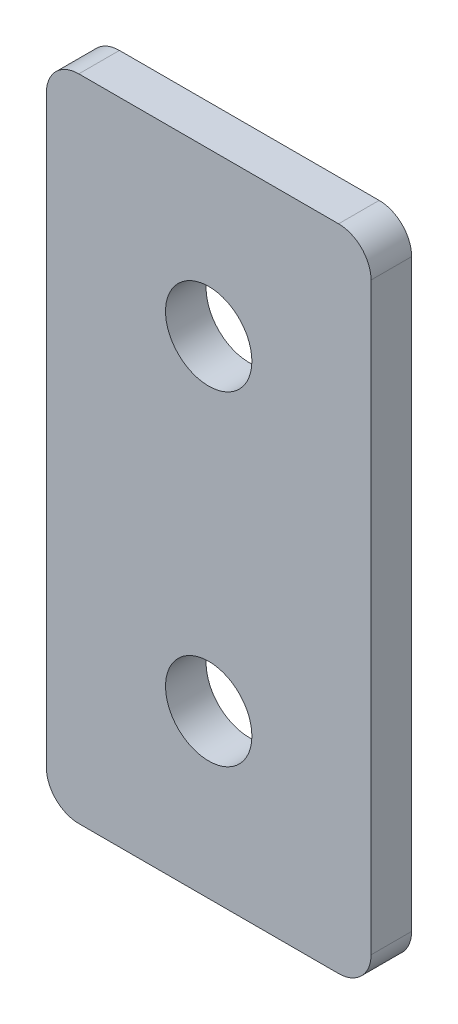
ISO-10303-21;
HEADER;
FILE_DESCRIPTION(('STEP AP214'),'2;1');
FILE_NAME('part.step','',(''),(''),'','','');
FILE_SCHEMA(('AUTOMOTIVE_DESIGN { 1 0 10303 214 1 1 1 1 }'));
ENDSEC;
DATA;
#1=APPLICATION_CONTEXT('core data for automotive mechanical design processes');
#2=APPLICATION_PROTOCOL_DEFINITION('international standard','automotive_design',2000,#1);
#3=PRODUCT_CONTEXT('',#1,'mechanical');
#4=PRODUCT('Part','Part','',(#3));
#5=PRODUCT_RELATED_PRODUCT_CATEGORY('part','',(#4));
#6=PRODUCT_DEFINITION_FORMATION('','',#4);
#7=PRODUCT_DEFINITION_CONTEXT('part definition',#1,'design');
#8=PRODUCT_DEFINITION('design','',#6,#7);
#9=PRODUCT_DEFINITION_SHAPE('','',#8);
#10=(LENGTH_UNIT() NAMED_UNIT(*) SI_UNIT(.MILLI.,.METRE.));
#11=(NAMED_UNIT(*) PLANE_ANGLE_UNIT() SI_UNIT($,.RADIAN.));
#12=(NAMED_UNIT(*) SI_UNIT($,.STERADIAN.) SOLID_ANGLE_UNIT());
#13=UNCERTAINTY_MEASURE_WITH_UNIT(LENGTH_MEASURE(1.E-05),#10,'distance_accuracy_value','');
#14=(GEOMETRIC_REPRESENTATION_CONTEXT(3) GLOBAL_UNCERTAINTY_ASSIGNED_CONTEXT((#13)) GLOBAL_UNIT_ASSIGNED_CONTEXT((#10,
#11,#12)) REPRESENTATION_CONTEXT('',''));
#15=CARTESIAN_POINT('',(0.,0.,0.));
#16=DIRECTION('',(0.,0.,1.));
#17=DIRECTION('',(1.,0.,0.));
#18=AXIS2_PLACEMENT_3D('',#15,#16,#17);
#19=CARTESIAN_POINT('',(-10.16,22.86,3.175));
#20=DIRECTION('',(0.,0.,-1.));
#21=DIRECTION('',(-1.,0.,0.));
#22=AXIS2_PLACEMENT_3D('',#19,#20,#21);
#23=PLANE('',#22);
#24=CARTESIAN_POINT('',(-10.16,22.86,3.175));
#25=DIRECTION('',(0.,0.,1.));
#26=DIRECTION('',(-1.,0.,0.));
#27=AXIS2_PLACEMENT_3D('',#24,#25,#26);
#28=CIRCLE('',#27,2.54);
#29=CARTESIAN_POINT('',(-10.16,25.4,3.175));
#30=VERTEX_POINT('',#29);
#31=CARTESIAN_POINT('',(-12.7,22.86,3.175));
#32=VERTEX_POINT('',#31);
#33=EDGE_CURVE('E164',#30,#32,#28,.T.);
#34=ORIENTED_EDGE('',*,*,#33,.T.);
#35=DIRECTION('',(0.,-1.,0.));
#36=VECTOR('',#35,1.);
#37=CARTESIAN_POINT('',(-12.7,-22.86,3.175));
#38=LINE('',#37,#36);
#39=CARTESIAN_POINT('',(-12.7,-22.86,3.175));
#40=VERTEX_POINT('',#39);
#41=EDGE_CURVE('E100',#32,#40,#38,.T.);
#42=ORIENTED_EDGE('',*,*,#41,.T.);
#43=CARTESIAN_POINT('',(-10.16,-22.86,3.175));
#44=DIRECTION('',(0.,0.,1.));
#45=DIRECTION('',(1.,0.,0.));
#46=AXIS2_PLACEMENT_3D('',#43,#44,#45);
#47=CIRCLE('',#46,2.54);
#48=CARTESIAN_POINT('',(-10.16,-25.4,3.175));
#49=VERTEX_POINT('',#48);
#50=EDGE_CURVE('E185',#40,#49,#47,.T.);
#51=ORIENTED_EDGE('',*,*,#50,.T.);
#52=DIRECTION('',(1.,0.,0.));
#53=VECTOR('',#52,1.);
#54=CARTESIAN_POINT('',(-10.16,-25.4,3.175));
#55=LINE('',#54,#53);
#56=CARTESIAN_POINT('',(10.16,-25.4,3.175));
#57=VERTEX_POINT('',#56);
#58=EDGE_CURVE('E199',#49,#57,#55,.T.);
#59=ORIENTED_EDGE('',*,*,#58,.T.);
#60=CARTESIAN_POINT('',(10.16,-22.86,3.175));
#61=DIRECTION('',(0.,0.,1.));
#62=DIRECTION('',(-1.,0.,0.));
#63=AXIS2_PLACEMENT_3D('',#60,#61,#62);
#64=CIRCLE('',#63,2.54);
#65=CARTESIAN_POINT('',(12.7,-22.86,3.175));
#66=VERTEX_POINT('',#65);
#67=EDGE_CURVE('E119',#57,#66,#64,.T.);
#68=ORIENTED_EDGE('',*,*,#67,.T.);
#69=DIRECTION('',(0.,1.,0.));
#70=VECTOR('',#69,1.);
#71=CARTESIAN_POINT('',(12.7,-22.86,3.175));
#72=LINE('',#71,#70);
#73=CARTESIAN_POINT('',(12.7,22.86,3.175));
#74=VERTEX_POINT('',#73);
#75=EDGE_CURVE('E113',#66,#74,#72,.T.);
#76=ORIENTED_EDGE('',*,*,#75,.T.);
#77=CARTESIAN_POINT('',(10.16,22.86,3.175));
#78=DIRECTION('',(0.,0.,1.));
#79=DIRECTION('',(1.,0.,0.));
#80=AXIS2_PLACEMENT_3D('',#77,#78,#79);
#81=CIRCLE('',#80,2.54);
#82=CARTESIAN_POINT('',(10.16,25.4,3.175));
#83=VERTEX_POINT('',#82);
#84=EDGE_CURVE('E117',#74,#83,#81,.T.);
#85=ORIENTED_EDGE('',*,*,#84,.T.);
#86=DIRECTION('',(-1.,0.,0.));
#87=VECTOR('',#86,1.);
#88=CARTESIAN_POINT('',(-10.16,25.4,3.175));
#89=LINE('',#88,#87);
#90=EDGE_CURVE('E57',#83,#30,#89,.T.);
#91=ORIENTED_EDGE('',*,*,#90,.T.);
#92=EDGE_LOOP('',(#34,#42,#51,#59,#68,#76,#85,#91));
#93=FACE_BOUND('',#92,.T.);
#94=CARTESIAN_POINT('',(0.,12.7,3.175));
#95=DIRECTION('',(0.,0.,1.));
#96=DIRECTION('',(1.,0.,0.));
#97=AXIS2_PLACEMENT_3D('',#94,#95,#96);
#98=CIRCLE('',#97,3.3782);
#99=CARTESIAN_POINT('',(3.3782,12.7,3.175));
#100=VERTEX_POINT('',#99);
#101=EDGE_CURVE('E146',#100,#100,#98,.T.);
#102=ORIENTED_EDGE('',*,*,#101,.F.);
#103=EDGE_LOOP('',(#102));
#104=FACE_BOUND('',#103,.T.);
#105=CARTESIAN_POINT('',(0.,-12.7,3.175));
#106=DIRECTION('',(0.,0.,1.));
#107=DIRECTION('',(1.,0.,0.));
#108=AXIS2_PLACEMENT_3D('',#105,#106,#107);
#109=CIRCLE('',#108,3.3782);
#110=CARTESIAN_POINT('',(3.3782,-12.7,3.175));
#111=VERTEX_POINT('',#110);
#112=EDGE_CURVE('E213',#111,#111,#109,.T.);
#113=ORIENTED_EDGE('',*,*,#112,.F.);
#114=EDGE_LOOP('',(#113));
#115=FACE_BOUND('',#114,.T.);
#116=ADVANCED_FACE('F39',(#93,#104,#115),#23,.F.);
#117=CARTESIAN_POINT('',(-10.16,22.86,0.));
#118=DIRECTION('',(0.,0.,-1.));
#119=DIRECTION('',(-1.,0.,0.));
#120=AXIS2_PLACEMENT_3D('',#117,#118,#119);
#121=PLANE('',#120);
#122=CARTESIAN_POINT('',(0.,12.7,0.));
#123=DIRECTION('',(0.,0.,1.));
#124=DIRECTION('',(1.,0.,0.));
#125=AXIS2_PLACEMENT_3D('',#122,#123,#124);
#126=CIRCLE('',#125,3.3782);
#127=CARTESIAN_POINT('',(3.3782,12.7,0.));
#128=VERTEX_POINT('',#127);
#129=EDGE_CURVE('E209',#128,#128,#126,.T.);
#130=ORIENTED_EDGE('',*,*,#129,.T.);
#131=EDGE_LOOP('',(#130));
#132=FACE_BOUND('',#131,.T.);
#133=CARTESIAN_POINT('',(-10.16,22.86,0.));
#134=DIRECTION('',(0.,0.,1.));
#135=DIRECTION('',(-1.,0.,0.));
#136=AXIS2_PLACEMENT_3D('',#133,#134,#135);
#137=CIRCLE('',#136,2.54);
#138=CARTESIAN_POINT('',(-10.16,25.4,0.));
#139=VERTEX_POINT('',#138);
#140=CARTESIAN_POINT('',(-12.7,22.86,0.));
#141=VERTEX_POINT('',#140);
#142=EDGE_CURVE('E141',#139,#141,#137,.T.);
#143=ORIENTED_EDGE('',*,*,#142,.F.);
#144=DIRECTION('',(-1.,0.,0.));
#145=VECTOR('',#144,1.);
#146=CARTESIAN_POINT('',(-10.16,25.4,0.));
#147=LINE('',#146,#145);
#148=CARTESIAN_POINT('',(10.16,25.4,0.));
#149=VERTEX_POINT('',#148);
#150=EDGE_CURVE('E92',#149,#139,#147,.T.);
#151=ORIENTED_EDGE('',*,*,#150,.F.);
#152=CARTESIAN_POINT('',(10.16,22.86,0.));
#153=DIRECTION('',(0.,0.,1.));
#154=DIRECTION('',(1.,0.,0.));
#155=AXIS2_PLACEMENT_3D('',#152,#153,#154);
#156=CIRCLE('',#155,2.54);
#157=CARTESIAN_POINT('',(12.7,22.86,0.));
#158=VERTEX_POINT('',#157);
#159=EDGE_CURVE('E86',#158,#149,#156,.T.);
#160=ORIENTED_EDGE('',*,*,#159,.F.);
#161=DIRECTION('',(0.,1.,0.));
#162=VECTOR('',#161,1.);
#163=CARTESIAN_POINT('',(12.7,-22.86,0.));
#164=LINE('',#163,#162);
#165=CARTESIAN_POINT('',(12.7,-22.86,0.));
#166=VERTEX_POINT('',#165);
#167=EDGE_CURVE('E128',#166,#158,#164,.T.);
#168=ORIENTED_EDGE('',*,*,#167,.F.);
#169=CARTESIAN_POINT('',(10.16,-22.86,0.));
#170=DIRECTION('',(0.,0.,1.));
#171=DIRECTION('',(-1.,0.,0.));
#172=AXIS2_PLACEMENT_3D('',#169,#170,#171);
#173=CIRCLE('',#172,2.54);
#174=CARTESIAN_POINT('',(10.16,-25.4,0.));
#175=VERTEX_POINT('',#174);
#176=EDGE_CURVE('E155',#175,#166,#173,.T.);
#177=ORIENTED_EDGE('',*,*,#176,.F.);
#178=DIRECTION('',(1.,0.,0.));
#179=VECTOR('',#178,1.);
#180=CARTESIAN_POINT('',(-10.16,-25.4,0.));
#181=LINE('',#180,#179);
#182=CARTESIAN_POINT('',(-10.16,-25.4,0.));
#183=VERTEX_POINT('',#182);
#184=EDGE_CURVE('E152',#183,#175,#181,.T.);
#185=ORIENTED_EDGE('',*,*,#184,.F.);
#186=CARTESIAN_POINT('',(-10.16,-22.86,0.));
#187=DIRECTION('',(0.,0.,1.));
#188=DIRECTION('',(1.,0.,0.));
#189=AXIS2_PLACEMENT_3D('',#186,#187,#188);
#190=CIRCLE('',#189,2.54);
#191=CARTESIAN_POINT('',(-12.7,-22.86,0.));
#192=VERTEX_POINT('',#191);
#193=EDGE_CURVE('E149',#192,#183,#190,.T.);
#194=ORIENTED_EDGE('',*,*,#193,.F.);
#195=DIRECTION('',(0.,-1.,0.));
#196=VECTOR('',#195,1.);
#197=CARTESIAN_POINT('',(-12.7,-22.86,0.));
#198=LINE('',#197,#196);
#199=EDGE_CURVE('E145',#141,#192,#198,.T.);
#200=ORIENTED_EDGE('',*,*,#199,.F.);
#201=EDGE_LOOP('',(#143,#151,#160,#168,#177,#185,#194,#200));
#202=FACE_BOUND('',#201,.T.);
#203=CARTESIAN_POINT('',(0.,-12.7,0.));
#204=DIRECTION('',(0.,0.,1.));
#205=DIRECTION('',(1.,0.,0.));
#206=AXIS2_PLACEMENT_3D('',#203,#204,#205);
#207=CIRCLE('',#206,3.3782);
#208=CARTESIAN_POINT('',(3.3782,-12.7,0.));
#209=VERTEX_POINT('',#208);
#210=EDGE_CURVE('E217',#209,#209,#207,.T.);
#211=ORIENTED_EDGE('',*,*,#210,.T.);
#212=EDGE_LOOP('',(#211));
#213=FACE_BOUND('',#212,.T.);
#214=ADVANCED_FACE('F189',(#132,#202,#213),#121,.T.);
#215=CARTESIAN_POINT('',(-10.16,22.86,3.175));
#216=DIRECTION('',(0.,0.,-1.));
#217=DIRECTION('',(-1.,0.,0.));
#218=AXIS2_PLACEMENT_3D('',#215,#216,#217);
#219=CYLINDRICAL_SURFACE('',#218,2.54);
#220=ORIENTED_EDGE('',*,*,#142,.T.);
#221=DIRECTION('',(0.,0.,-1.));
#222=VECTOR('',#221,1.);
#223=CARTESIAN_POINT('',(-12.7,22.86,3.175));
#224=LINE('',#223,#222);
#225=EDGE_CURVE('E11',#32,#141,#224,.T.);
#226=ORIENTED_EDGE('',*,*,#225,.F.);
#227=ORIENTED_EDGE('',*,*,#33,.F.);
#228=DIRECTION('',(0.,0.,-1.));
#229=VECTOR('',#228,1.);
#230=CARTESIAN_POINT('',(-10.16,25.4,3.175));
#231=LINE('',#230,#229);
#232=EDGE_CURVE('E137',#30,#139,#231,.T.);
#233=ORIENTED_EDGE('',*,*,#232,.T.);
#234=EDGE_LOOP('',(#220,#226,#227,#233));
#235=FACE_BOUND('',#234,.T.);
#236=ADVANCED_FACE('F41',(#235),#219,.T.);
#237=CARTESIAN_POINT('',(-12.7,-22.86,3.175));
#238=DIRECTION('',(1.,0.,0.));
#239=DIRECTION('',(0.,0.,-1.));
#240=AXIS2_PLACEMENT_3D('',#237,#238,#239);
#241=PLANE('',#240);
#242=ORIENTED_EDGE('',*,*,#199,.T.);
#243=DIRECTION('',(0.,0.,-1.));
#244=VECTOR('',#243,1.);
#245=CARTESIAN_POINT('',(-12.7,-22.86,3.175));
#246=LINE('',#245,#244);
#247=EDGE_CURVE('E49',#40,#192,#246,.T.);
#248=ORIENTED_EDGE('',*,*,#247,.F.);
#249=ORIENTED_EDGE('',*,*,#41,.F.);
#250=ORIENTED_EDGE('',*,*,#225,.T.);
#251=EDGE_LOOP('',(#242,#248,#249,#250));
#252=FACE_BOUND('',#251,.T.);
#253=ADVANCED_FACE('F251',(#252),#241,.F.);
#254=CARTESIAN_POINT('',(-10.16,-22.86,3.175));
#255=DIRECTION('',(0.,0.,-1.));
#256=DIRECTION('',(-1.,0.,0.));
#257=AXIS2_PLACEMENT_3D('',#254,#255,#256);
#258=CYLINDRICAL_SURFACE('',#257,2.54);
#259=ORIENTED_EDGE('',*,*,#193,.T.);
#260=DIRECTION('',(0.,0.,-1.));
#261=VECTOR('',#260,1.);
#262=CARTESIAN_POINT('',(-10.16,-25.4,3.175));
#263=LINE('',#262,#261);
#264=EDGE_CURVE('E175',#49,#183,#263,.T.);
#265=ORIENTED_EDGE('',*,*,#264,.F.);
#266=ORIENTED_EDGE('',*,*,#50,.F.);
#267=ORIENTED_EDGE('',*,*,#247,.T.);
#268=EDGE_LOOP('',(#259,#265,#266,#267));
#269=FACE_BOUND('',#268,.T.);
#270=ADVANCED_FACE('F183',(#269),#258,.T.);
#271=CARTESIAN_POINT('',(-10.16,-25.4,3.175));
#272=DIRECTION('',(0.,1.,0.));
#273=DIRECTION('',(0.,0.,1.));
#274=AXIS2_PLACEMENT_3D('',#271,#272,#273);
#275=PLANE('',#274);
#276=ORIENTED_EDGE('',*,*,#184,.T.);
#277=DIRECTION('',(0.,0.,-1.));
#278=VECTOR('',#277,1.);
#279=CARTESIAN_POINT('',(10.16,-25.4,3.175));
#280=LINE('',#279,#278);
#281=EDGE_CURVE('E171',#57,#175,#280,.T.);
#282=ORIENTED_EDGE('',*,*,#281,.F.);
#283=ORIENTED_EDGE('',*,*,#58,.F.);
#284=ORIENTED_EDGE('',*,*,#264,.T.);
#285=EDGE_LOOP('',(#276,#282,#283,#284));
#286=FACE_BOUND('',#285,.T.);
#287=ADVANCED_FACE('F194',(#286),#275,.F.);
#288=CARTESIAN_POINT('',(10.16,-22.86,3.175));
#289=DIRECTION('',(0.,0.,-1.));
#290=DIRECTION('',(-1.,0.,0.));
#291=AXIS2_PLACEMENT_3D('',#288,#289,#290);
#292=CYLINDRICAL_SURFACE('',#291,2.54);
#293=ORIENTED_EDGE('',*,*,#176,.T.);
#294=DIRECTION('',(0.,0.,-1.));
#295=VECTOR('',#294,1.);
#296=CARTESIAN_POINT('',(12.7,-22.86,3.175));
#297=LINE('',#296,#295);
#298=EDGE_CURVE('E130',#66,#166,#297,.T.);
#299=ORIENTED_EDGE('',*,*,#298,.F.);
#300=ORIENTED_EDGE('',*,*,#67,.F.);
#301=ORIENTED_EDGE('',*,*,#281,.T.);
#302=EDGE_LOOP('',(#293,#299,#300,#301));
#303=FACE_BOUND('',#302,.T.);
#304=ADVANCED_FACE('F197',(#303),#292,.T.);
#305=CARTESIAN_POINT('',(12.7,-22.86,3.175));
#306=DIRECTION('',(-1.,0.,0.));
#307=DIRECTION('',(0.,0.,1.));
#308=AXIS2_PLACEMENT_3D('',#305,#306,#307);
#309=PLANE('',#308);
#310=ORIENTED_EDGE('',*,*,#167,.T.);
#311=DIRECTION('',(0.,0.,-1.));
#312=VECTOR('',#311,1.);
#313=CARTESIAN_POINT('',(12.7,22.86,3.175));
#314=LINE('',#313,#312);
#315=EDGE_CURVE('E125',#74,#158,#314,.T.);
#316=ORIENTED_EDGE('',*,*,#315,.F.);
#317=ORIENTED_EDGE('',*,*,#75,.F.);
#318=ORIENTED_EDGE('',*,*,#298,.T.);
#319=EDGE_LOOP('',(#310,#316,#317,#318));
#320=FACE_BOUND('',#319,.T.);
#321=ADVANCED_FACE('F126',(#320),#309,.F.);
#322=CARTESIAN_POINT('',(10.16,22.86,3.175));
#323=DIRECTION('',(0.,0.,-1.));
#324=DIRECTION('',(-1.,0.,0.));
#325=AXIS2_PLACEMENT_3D('',#322,#323,#324);
#326=CYLINDRICAL_SURFACE('',#325,2.54);
#327=ORIENTED_EDGE('',*,*,#159,.T.);
#328=DIRECTION('',(0.,0.,-1.));
#329=VECTOR('',#328,1.);
#330=CARTESIAN_POINT('',(10.16,25.4,3.175));
#331=LINE('',#330,#329);
#332=EDGE_CURVE('E131',#83,#149,#331,.T.);
#333=ORIENTED_EDGE('',*,*,#332,.F.);
#334=ORIENTED_EDGE('',*,*,#84,.F.);
#335=ORIENTED_EDGE('',*,*,#315,.T.);
#336=EDGE_LOOP('',(#327,#333,#334,#335));
#337=FACE_BOUND('',#336,.T.);
#338=ADVANCED_FACE('F133',(#337),#326,.T.);
#339=CARTESIAN_POINT('',(-10.16,25.4,3.175));
#340=DIRECTION('',(0.,-1.,0.));
#341=DIRECTION('',(0.,0.,-1.));
#342=AXIS2_PLACEMENT_3D('',#339,#340,#341);
#343=PLANE('',#342);
#344=ORIENTED_EDGE('',*,*,#150,.T.);
#345=ORIENTED_EDGE('',*,*,#232,.F.);
#346=ORIENTED_EDGE('',*,*,#90,.F.);
#347=ORIENTED_EDGE('',*,*,#332,.T.);
#348=EDGE_LOOP('',(#344,#345,#346,#347));
#349=FACE_BOUND('',#348,.T.);
#350=ADVANCED_FACE('F239',(#349),#343,.F.);
#351=CARTESIAN_POINT('',(0.,12.7,3.175));
#352=DIRECTION('',(0.,0.,-1.));
#353=DIRECTION('',(-1.,0.,0.));
#354=AXIS2_PLACEMENT_3D('',#351,#352,#353);
#355=CYLINDRICAL_SURFACE('',#354,3.3782);
#356=ORIENTED_EDGE('',*,*,#101,.T.);
#357=EDGE_LOOP('',(#356));
#358=FACE_BOUND('',#357,.T.);
#359=ORIENTED_EDGE('',*,*,#129,.F.);
#360=EDGE_LOOP('',(#359));
#361=FACE_BOUND('',#360,.T.);
#362=ADVANCED_FACE('F236',(#358,#361),#355,.F.);
#363=CARTESIAN_POINT('',(0.,-12.7,3.175));
#364=DIRECTION('',(0.,0.,-1.));
#365=DIRECTION('',(-1.,0.,0.));
#366=AXIS2_PLACEMENT_3D('',#363,#364,#365);
#367=CYLINDRICAL_SURFACE('',#366,3.3782);
#368=ORIENTED_EDGE('',*,*,#112,.T.);
#369=EDGE_LOOP('',(#368));
#370=FACE_BOUND('',#369,.T.);
#371=ORIENTED_EDGE('',*,*,#210,.F.);
#372=EDGE_LOOP('',(#371));
#373=FACE_BOUND('',#372,.T.);
#374=ADVANCED_FACE('F225',(#370,#373),#367,.F.);
#375=CLOSED_SHELL('',(#116,#214,#236,#253,#270,#287,#304,#321,#338,#350,#362,#374));
#376=MANIFOLD_SOLID_BREP('B2',#375);
#377=ADVANCED_BREP_SHAPE_REPRESENTATION('',(#18,#376),#14);
#378=SHAPE_DEFINITION_REPRESENTATION(#9,#377);
ENDSEC;
END-ISO-10303-21;
